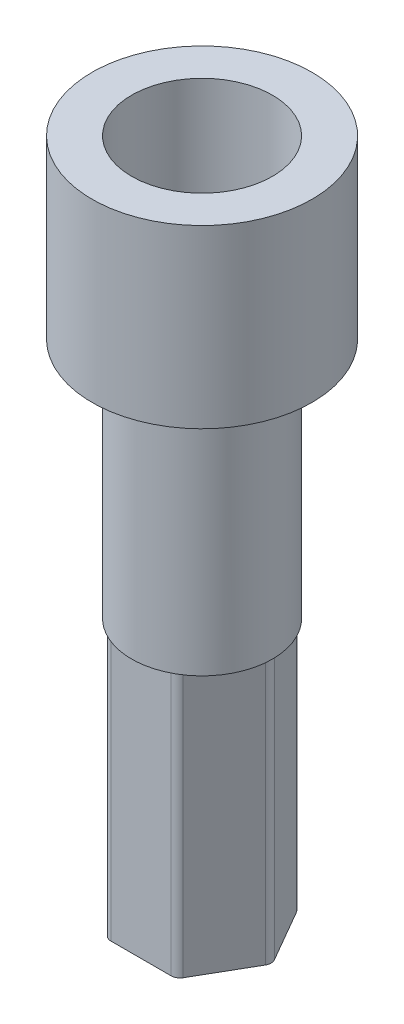
ISO-10303-21;
HEADER;
FILE_DESCRIPTION(('STEP AP214'),'2;1');
FILE_NAME('part.step','',(''),(''),'','','');
FILE_SCHEMA(('AUTOMOTIVE_DESIGN { 1 0 10303 214 1 1 1 1 }'));
ENDSEC;
DATA;
#1=APPLICATION_CONTEXT('core data for automotive mechanical design processes');
#2=APPLICATION_PROTOCOL_DEFINITION('international standard','automotive_design',2000,#1);
#3=PRODUCT_CONTEXT('',#1,'mechanical');
#4=PRODUCT('Part','Part','',(#3));
#5=PRODUCT_RELATED_PRODUCT_CATEGORY('part','',(#4));
#6=PRODUCT_DEFINITION_FORMATION('','',#4);
#7=PRODUCT_DEFINITION_CONTEXT('part definition',#1,'design');
#8=PRODUCT_DEFINITION('design','',#6,#7);
#9=PRODUCT_DEFINITION_SHAPE('','',#8);
#10=(LENGTH_UNIT() NAMED_UNIT(*) SI_UNIT(.MILLI.,.METRE.));
#11=(NAMED_UNIT(*) PLANE_ANGLE_UNIT() SI_UNIT($,.RADIAN.));
#12=(NAMED_UNIT(*) SI_UNIT($,.STERADIAN.) SOLID_ANGLE_UNIT());
#13=UNCERTAINTY_MEASURE_WITH_UNIT(LENGTH_MEASURE(1.E-05),#10,'distance_accuracy_value','');
#14=(GEOMETRIC_REPRESENTATION_CONTEXT(3) GLOBAL_UNCERTAINTY_ASSIGNED_CONTEXT((#13)) GLOBAL_UNIT_ASSIGNED_CONTEXT((#10,
#11,#12)) REPRESENTATION_CONTEXT('',''));
#15=CARTESIAN_POINT('',(0.,0.,0.));
#16=DIRECTION('',(0.,0.,1.));
#17=DIRECTION('',(1.,0.,0.));
#18=AXIS2_PLACEMENT_3D('',#15,#16,#17);
#19=CARTESIAN_POINT('',(0.,0.,0.));
#20=DIRECTION('',(0.,-1.,0.));
#21=DIRECTION('',(0.,0.,-1.));
#22=AXIS2_PLACEMENT_3D('',#19,#20,#21);
#23=PLANE('',#22);
#24=DIRECTION('',(-0.5,0.,-0.866025403784439));
#25=VECTOR('',#24,1.);
#26=CARTESIAN_POINT('',(-3.048,0.,1.75976362048998));
#27=LINE('',#26,#25);
#28=CARTESIAN_POINT('',(-2.17864696837417,0.,3.26552724097996));
#29=VERTEX_POINT('',#28);
#30=CARTESIAN_POINT('',(-3.91735303162584,0.,0.253999999999999));
#31=VERTEX_POINT('',#30);
#32=EDGE_CURVE('E309',#29,#31,#27,.T.);
#33=ORIENTED_EDGE('',*,*,#32,.T.);
#34=CARTESIAN_POINT('',(-3.47741212650334,0.,0.));
#35=DIRECTION('',(0.,-1.,0.));
#36=DIRECTION('',(0.,0.,-1.));
#37=AXIS2_PLACEMENT_3D('',#34,#35,#36);
#38=CIRCLE('',#37,0.508);
#39=CARTESIAN_POINT('',(-3.91735303162584,0.,-0.254));
#40=VERTEX_POINT('',#39);
#41=EDGE_CURVE('E224',#31,#40,#38,.T.);
#42=ORIENTED_EDGE('',*,*,#41,.T.);
#43=DIRECTION('',(0.5,0.,-0.866025403784439));
#44=VECTOR('',#43,1.);
#45=CARTESIAN_POINT('',(-3.048,0.,-1.75976362048998));
#46=LINE('',#45,#44);
#47=CARTESIAN_POINT('',(-2.17864696837417,0.,-3.26552724097996));
#48=VERTEX_POINT('',#47);
#49=EDGE_CURVE('E315',#40,#48,#46,.T.);
#50=ORIENTED_EDGE('',*,*,#49,.T.);
#51=CARTESIAN_POINT('',(-1.73870606325167,0.,-3.01152724097996));
#52=DIRECTION('',(0.,-1.,0.));
#53=DIRECTION('',(0.,0.,-1.));
#54=AXIS2_PLACEMENT_3D('',#51,#52,#53);
#55=CIRCLE('',#54,0.508);
#56=CARTESIAN_POINT('',(-1.73870606325167,0.,-3.51952724097996));
#57=VERTEX_POINT('',#56);
#58=EDGE_CURVE('E221',#48,#57,#55,.T.);
#59=ORIENTED_EDGE('',*,*,#58,.T.);
#60=DIRECTION('',(1.,0.,0.));
#61=VECTOR('',#60,1.);
#62=CARTESIAN_POINT('',(0.,0.,-3.51952724097996));
#63=LINE('',#62,#61);
#64=CARTESIAN_POINT('',(1.73870606325167,0.,-3.51952724097996));
#65=VERTEX_POINT('',#64);
#66=EDGE_CURVE('E155',#57,#65,#63,.T.);
#67=ORIENTED_EDGE('',*,*,#66,.T.);
#68=CARTESIAN_POINT('',(1.73870606325167,0.,-3.01152724097996));
#69=DIRECTION('',(0.,-1.,0.));
#70=DIRECTION('',(0.,0.,-1.));
#71=AXIS2_PLACEMENT_3D('',#68,#69,#70);
#72=CIRCLE('',#71,0.508);
#73=CARTESIAN_POINT('',(2.17864696837417,0.,-3.26552724097996));
#74=VERTEX_POINT('',#73);
#75=EDGE_CURVE('E215',#65,#74,#72,.T.);
#76=ORIENTED_EDGE('',*,*,#75,.T.);
#77=DIRECTION('',(0.5,0.,0.866025403784439));
#78=VECTOR('',#77,1.);
#79=CARTESIAN_POINT('',(3.04800000000001,0.,-1.75976362048998));
#80=LINE('',#79,#78);
#81=CARTESIAN_POINT('',(3.91735303162584,0.,-0.253999999999999));
#82=VERTEX_POINT('',#81);
#83=EDGE_CURVE('E181',#74,#82,#80,.T.);
#84=ORIENTED_EDGE('',*,*,#83,.T.);
#85=CARTESIAN_POINT('',(3.47741212650335,0.,0.));
#86=DIRECTION('',(0.,-1.,0.));
#87=DIRECTION('',(0.,0.,-1.));
#88=AXIS2_PLACEMENT_3D('',#85,#86,#87);
#89=CIRCLE('',#88,0.508);
#90=CARTESIAN_POINT('',(3.91735303162584,0.,0.254));
#91=VERTEX_POINT('',#90);
#92=EDGE_CURVE('E212',#82,#91,#89,.T.);
#93=ORIENTED_EDGE('',*,*,#92,.T.);
#94=DIRECTION('',(-0.5,0.,0.866025403784439));
#95=VECTOR('',#94,1.);
#96=CARTESIAN_POINT('',(3.048,0.,1.75976362048998));
#97=LINE('',#96,#95);
#98=CARTESIAN_POINT('',(2.17864696837417,0.,3.26552724097996));
#99=VERTEX_POINT('',#98);
#100=EDGE_CURVE('E305',#91,#99,#97,.T.);
#101=ORIENTED_EDGE('',*,*,#100,.T.);
#102=CARTESIAN_POINT('',(1.73870606325167,0.,3.01152724097996));
#103=DIRECTION('',(0.,-1.,0.));
#104=DIRECTION('',(0.,0.,-1.));
#105=AXIS2_PLACEMENT_3D('',#102,#103,#104);
#106=CIRCLE('',#105,0.508);
#107=CARTESIAN_POINT('',(1.73870606325167,0.,3.51952724097996));
#108=VERTEX_POINT('',#107);
#109=EDGE_CURVE('E209',#99,#108,#106,.T.);
#110=ORIENTED_EDGE('',*,*,#109,.T.);
#111=DIRECTION('',(-1.,0.,0.));
#112=VECTOR('',#111,1.);
#113=CARTESIAN_POINT('',(0.,0.,3.51952724097996));
#114=LINE('',#113,#112);
#115=CARTESIAN_POINT('',(-1.73870606325167,0.,3.51952724097996));
#116=VERTEX_POINT('',#115);
#117=EDGE_CURVE('E171',#108,#116,#114,.T.);
#118=ORIENTED_EDGE('',*,*,#117,.T.);
#119=CARTESIAN_POINT('',(-1.73870606325167,0.,3.01152724097996));
#120=DIRECTION('',(0.,-1.,0.));
#121=DIRECTION('',(0.,0.,-1.));
#122=AXIS2_PLACEMENT_3D('',#119,#120,#121);
#123=CIRCLE('',#122,0.508);
#124=EDGE_CURVE('E218',#116,#29,#123,.T.);
#125=ORIENTED_EDGE('',*,*,#124,.T.);
#126=EDGE_LOOP('',(#33,#42,#50,#59,#67,#76,#84,#93,#101,#110,#118,#125));
#127=FACE_BOUND('',#126,.T.);
#128=ADVANCED_FACE('F38',(#127),#23,.T.);
#129=CARTESIAN_POINT('',(0.,0.,0.));
#130=DIRECTION('',(0.,-1.,0.));
#131=DIRECTION('',(0.,0.,-1.));
#132=AXIS2_PLACEMENT_3D('',#129,#130,#131);
#133=CYLINDRICAL_SURFACE('',#132,4.064);
#134=CARTESIAN_POINT('',(0.,29.21,0.));
#135=DIRECTION('',(0.,-1.,0.));
#136=DIRECTION('',(0.,0.,-1.));
#137=AXIS2_PLACEMENT_3D('',#134,#135,#136);
#138=CIRCLE('',#137,4.064);
#139=CARTESIAN_POINT('',(0.,29.21,-4.064));
#140=VERTEX_POINT('',#139);
#141=EDGE_CURVE('E198',#140,#140,#138,.T.);
#142=ORIENTED_EDGE('',*,*,#141,.T.);
#143=EDGE_LOOP('',(#142));
#144=FACE_BOUND('',#143,.T.);
#145=CARTESIAN_POINT('',(0.,15.24,0.));
#146=DIRECTION('',(0.,-1.,0.));
#147=DIRECTION('',(0.,0.,-1.));
#148=AXIS2_PLACEMENT_3D('',#145,#146,#147);
#149=CIRCLE('',#148,4.064);
#150=CARTESIAN_POINT('',(-4.064,15.24,0.));
#151=VERTEX_POINT('',#150);
#152=CARTESIAN_POINT('',(-2.032,15.24,-3.51952724097996));
#153=VERTEX_POINT('',#152);
#154=EDGE_CURVE('E152',#151,#153,#149,.T.);
#155=ORIENTED_EDGE('',*,*,#154,.F.);
#156=CARTESIAN_POINT('',(0.,15.24,0.));
#157=DIRECTION('',(0.,-1.,0.));
#158=DIRECTION('',(0.,0.,-1.));
#159=AXIS2_PLACEMENT_3D('',#156,#157,#158);
#160=CIRCLE('',#159,4.064);
#161=CARTESIAN_POINT('',(-2.032,15.24,3.51952724097996));
#162=VERTEX_POINT('',#161);
#163=EDGE_CURVE('E147',#162,#151,#160,.T.);
#164=ORIENTED_EDGE('',*,*,#163,.F.);
#165=CARTESIAN_POINT('',(0.,15.24,0.));
#166=DIRECTION('',(0.,-1.,0.));
#167=DIRECTION('',(0.,0.,-1.));
#168=AXIS2_PLACEMENT_3D('',#165,#166,#167);
#169=CIRCLE('',#168,4.064);
#170=CARTESIAN_POINT('',(2.032,15.24,3.51952724097996));
#171=VERTEX_POINT('',#170);
#172=EDGE_CURVE('E150',#171,#162,#169,.T.);
#173=ORIENTED_EDGE('',*,*,#172,.F.);
#174=CARTESIAN_POINT('',(0.,15.24,0.));
#175=DIRECTION('',(0.,-1.,0.));
#176=DIRECTION('',(0.,0.,-1.));
#177=AXIS2_PLACEMENT_3D('',#174,#175,#176);
#178=CIRCLE('',#177,4.064);
#179=CARTESIAN_POINT('',(4.064,15.24,0.));
#180=VERTEX_POINT('',#179);
#181=EDGE_CURVE('E161',#180,#171,#178,.T.);
#182=ORIENTED_EDGE('',*,*,#181,.F.);
#183=CARTESIAN_POINT('',(0.,15.24,0.));
#184=DIRECTION('',(0.,-1.,0.));
#185=DIRECTION('',(0.,0.,-1.));
#186=AXIS2_PLACEMENT_3D('',#183,#184,#185);
#187=CIRCLE('',#186,4.064);
#188=CARTESIAN_POINT('',(2.032,15.24,-3.51952724097996));
#189=VERTEX_POINT('',#188);
#190=EDGE_CURVE('E178',#189,#180,#187,.T.);
#191=ORIENTED_EDGE('',*,*,#190,.F.);
#192=CARTESIAN_POINT('',(0.,15.24,0.));
#193=DIRECTION('',(0.,-1.,0.));
#194=DIRECTION('',(0.,0.,-1.));
#195=AXIS2_PLACEMENT_3D('',#192,#193,#194);
#196=CIRCLE('',#195,4.064);
#197=EDGE_CURVE('E301',#153,#189,#196,.T.);
#198=ORIENTED_EDGE('',*,*,#197,.F.);
#199=EDGE_LOOP('',(#155,#164,#173,#182,#191,#198));
#200=FACE_BOUND('',#199,.T.);
#201=ADVANCED_FACE('F149',(#144,#200),#133,.T.);
#202=CARTESIAN_POINT('',(0.,29.21,-4.064));
#203=DIRECTION('',(0.,-1.,0.));
#204=DIRECTION('',(0.,0.,-1.));
#205=AXIS2_PLACEMENT_3D('',#202,#203,#204);
#206=PLANE('',#205);
#207=CARTESIAN_POINT('',(0.,29.21,0.));
#208=DIRECTION('',(0.,-1.,0.));
#209=DIRECTION('',(0.,0.,-1.));
#210=AXIS2_PLACEMENT_3D('',#207,#208,#209);
#211=CIRCLE('',#210,6.35);
#212=CARTESIAN_POINT('',(0.,29.21,-6.35));
#213=VERTEX_POINT('',#212);
#214=EDGE_CURVE('E194',#213,#213,#211,.T.);
#215=ORIENTED_EDGE('',*,*,#214,.T.);
#216=EDGE_LOOP('',(#215));
#217=FACE_BOUND('',#216,.T.);
#218=ORIENTED_EDGE('',*,*,#141,.F.);
#219=EDGE_LOOP('',(#218));
#220=FACE_BOUND('',#219,.T.);
#221=ADVANCED_FACE('F356',(#217,#220),#206,.T.);
#222=CARTESIAN_POINT('',(0.,0.,0.));
#223=DIRECTION('',(0.,-1.,0.));
#224=DIRECTION('',(0.,0.,-1.));
#225=AXIS2_PLACEMENT_3D('',#222,#223,#224);
#226=CYLINDRICAL_SURFACE('',#225,6.35);
#227=CARTESIAN_POINT('',(0.,39.37,0.));
#228=DIRECTION('',(0.,-1.,0.));
#229=DIRECTION('',(0.,0.,-1.));
#230=AXIS2_PLACEMENT_3D('',#227,#228,#229);
#231=CIRCLE('',#230,6.35);
#232=CARTESIAN_POINT('',(0.,39.37,-6.35));
#233=VERTEX_POINT('',#232);
#234=EDGE_CURVE('E189',#233,#233,#231,.T.);
#235=ORIENTED_EDGE('',*,*,#234,.T.);
#236=EDGE_LOOP('',(#235));
#237=FACE_BOUND('',#236,.T.);
#238=ORIENTED_EDGE('',*,*,#214,.F.);
#239=EDGE_LOOP('',(#238));
#240=FACE_BOUND('',#239,.T.);
#241=ADVANCED_FACE('F362',(#237,#240),#226,.T.);
#242=CARTESIAN_POINT('',(0.,39.37,-6.35));
#243=DIRECTION('',(0.,1.,0.));
#244=DIRECTION('',(0.,0.,1.));
#245=AXIS2_PLACEMENT_3D('',#242,#243,#244);
#246=PLANE('',#245);
#247=CARTESIAN_POINT('',(0.,39.37,0.));
#248=DIRECTION('',(0.,1.,0.));
#249=DIRECTION('',(0.,0.,1.));
#250=AXIS2_PLACEMENT_3D('',#247,#248,#249);
#251=CIRCLE('',#250,4.064);
#252=CARTESIAN_POINT('',(0.,39.37,4.064));
#253=VERTEX_POINT('',#252);
#254=EDGE_CURVE('E163',#253,#253,#251,.T.);
#255=ORIENTED_EDGE('',*,*,#254,.F.);
#256=EDGE_LOOP('',(#255));
#257=FACE_BOUND('',#256,.T.);
#258=ORIENTED_EDGE('',*,*,#234,.F.);
#259=EDGE_LOOP('',(#258));
#260=FACE_BOUND('',#259,.T.);
#261=ADVANCED_FACE('F366',(#257,#260),#246,.T.);
#262=CARTESIAN_POINT('',(0.,30.988,0.));
#263=DIRECTION('',(0.,1.,0.));
#264=DIRECTION('',(0.,0.,1.));
#265=AXIS2_PLACEMENT_3D('',#262,#263,#264);
#266=CYLINDRICAL_SURFACE('',#265,4.064);
#267=CARTESIAN_POINT('',(0.,30.988,0.));
#268=DIRECTION('',(0.,1.,0.));
#269=DIRECTION('',(0.,0.,1.));
#270=AXIS2_PLACEMENT_3D('',#267,#268,#269);
#271=CIRCLE('',#270,4.064);
#272=CARTESIAN_POINT('',(0.,30.988,4.064));
#273=VERTEX_POINT('',#272);
#274=EDGE_CURVE('E169',#273,#273,#271,.T.);
#275=ORIENTED_EDGE('',*,*,#274,.F.);
#276=EDGE_LOOP('',(#275));
#277=FACE_BOUND('',#276,.T.);
#278=ORIENTED_EDGE('',*,*,#254,.T.);
#279=EDGE_LOOP('',(#278));
#280=FACE_BOUND('',#279,.T.);
#281=ADVANCED_FACE('F370',(#277,#280),#266,.F.);
#282=CARTESIAN_POINT('',(0.,30.988,0.));
#283=DIRECTION('',(0.,1.,0.));
#284=DIRECTION('',(0.,0.,1.));
#285=AXIS2_PLACEMENT_3D('',#282,#283,#284);
#286=PLANE('',#285);
#287=ORIENTED_EDGE('',*,*,#274,.T.);
#288=EDGE_LOOP('',(#287));
#289=FACE_BOUND('',#288,.T.);
#290=ADVANCED_FACE('F374',(#289),#286,.T.);
#291=CARTESIAN_POINT('',(0.,15.24,3.51952724097996));
#292=DIRECTION('',(0.,0.,1.));
#293=DIRECTION('',(1.,0.,0.));
#294=AXIS2_PLACEMENT_3D('',#291,#292,#293);
#295=PLANE('',#294);
#296=DIRECTION('',(-1.,0.,0.));
#297=VECTOR('',#296,1.);
#298=CARTESIAN_POINT('',(0.,15.24,3.51952724097996));
#299=LINE('',#298,#297);
#300=CARTESIAN_POINT('',(1.73870606325167,15.24,3.51952724097996));
#301=VERTEX_POINT('',#300);
#302=CARTESIAN_POINT('',(-1.73870606325167,15.24,3.51952724097996));
#303=VERTEX_POINT('',#302);
#304=EDGE_CURVE('E164',#301,#303,#299,.T.);
#305=ORIENTED_EDGE('',*,*,#304,.T.);
#306=DIRECTION('',(0.,-1.,0.));
#307=VECTOR('',#306,1.);
#308=CARTESIAN_POINT('',(-1.73870606325167,15.24,3.51952724097996));
#309=LINE('',#308,#307);
#310=EDGE_CURVE('E244',#303,#116,#309,.T.);
#311=ORIENTED_EDGE('',*,*,#310,.T.);
#312=ORIENTED_EDGE('',*,*,#117,.F.);
#313=DIRECTION('',(0.,-1.,0.));
#314=VECTOR('',#313,1.);
#315=CARTESIAN_POINT('',(1.73870606325167,15.24,3.51952724097996));
#316=LINE('',#315,#314);
#317=EDGE_CURVE('E241',#108,#301,#316,.F.);
#318=ORIENTED_EDGE('',*,*,#317,.T.);
#319=EDGE_LOOP('',(#305,#311,#312,#318));
#320=FACE_BOUND('',#319,.T.);
#321=ADVANCED_FACE('F378',(#320),#295,.T.);
#322=CARTESIAN_POINT('',(3.04800000000001,15.24,-1.75976362048998));
#323=DIRECTION('',(0.866025403784439,0.,-0.5));
#324=DIRECTION('',(-0.5,0.,-0.866025403784439));
#325=AXIS2_PLACEMENT_3D('',#322,#323,#324);
#326=PLANE('',#325);
#327=ORIENTED_EDGE('',*,*,#83,.F.);
#328=DIRECTION('',(0.,-1.,0.));
#329=VECTOR('',#328,1.);
#330=CARTESIAN_POINT('',(2.17864696837417,15.24,-3.26552724097996));
#331=LINE('',#330,#329);
#332=CARTESIAN_POINT('',(2.17864696837417,15.24,-3.26552724097996));
#333=VERTEX_POINT('',#332);
#334=EDGE_CURVE('E251',#74,#333,#331,.F.);
#335=ORIENTED_EDGE('',*,*,#334,.T.);
#336=DIRECTION('',(0.5,0.,0.866025403784439));
#337=VECTOR('',#336,1.);
#338=CARTESIAN_POINT('',(3.04800000000001,15.24,-1.75976362048998));
#339=LINE('',#338,#337);
#340=CARTESIAN_POINT('',(3.91735303162584,15.24,-0.253999999999999));
#341=VERTEX_POINT('',#340);
#342=EDGE_CURVE('E61',#333,#341,#339,.T.);
#343=ORIENTED_EDGE('',*,*,#342,.T.);
#344=DIRECTION('',(0.,-1.,0.));
#345=VECTOR('',#344,1.);
#346=CARTESIAN_POINT('',(3.91735303162584,15.24,-0.253999999999999));
#347=LINE('',#346,#345);
#348=EDGE_CURVE('E248',#341,#82,#347,.T.);
#349=ORIENTED_EDGE('',*,*,#348,.T.);
#350=EDGE_LOOP('',(#327,#335,#343,#349));
#351=FACE_BOUND('',#350,.T.);
#352=ADVANCED_FACE('F283',(#351),#326,.T.);
#353=CARTESIAN_POINT('',(-3.048,15.24,-1.75976362048998));
#354=DIRECTION('',(-0.866025403784439,0.,-0.5));
#355=DIRECTION('',(-0.5,0.,0.866025403784439));
#356=AXIS2_PLACEMENT_3D('',#353,#354,#355);
#357=PLANE('',#356);
#358=ORIENTED_EDGE('',*,*,#49,.F.);
#359=DIRECTION('',(0.,-1.,0.));
#360=VECTOR('',#359,1.);
#361=CARTESIAN_POINT('',(-3.91735303162584,15.24,-0.254));
#362=LINE('',#361,#360);
#363=CARTESIAN_POINT('',(-3.91735303162584,15.24,-0.254));
#364=VERTEX_POINT('',#363);
#365=EDGE_CURVE('E231',#40,#364,#362,.F.);
#366=ORIENTED_EDGE('',*,*,#365,.T.);
#367=DIRECTION('',(0.5,0.,-0.866025403784439));
#368=VECTOR('',#367,1.);
#369=CARTESIAN_POINT('',(-3.048,15.24,-1.75976362048998));
#370=LINE('',#369,#368);
#371=CARTESIAN_POINT('',(-2.17864696837417,15.24,-3.26552724097996));
#372=VERTEX_POINT('',#371);
#373=EDGE_CURVE('E318',#364,#372,#370,.T.);
#374=ORIENTED_EDGE('',*,*,#373,.T.);
#375=DIRECTION('',(0.,-1.,0.));
#376=VECTOR('',#375,1.);
#377=CARTESIAN_POINT('',(-2.17864696837417,15.24,-3.26552724097996));
#378=LINE('',#377,#376);
#379=EDGE_CURVE('E227',#372,#48,#378,.T.);
#380=ORIENTED_EDGE('',*,*,#379,.T.);
#381=EDGE_LOOP('',(#358,#366,#374,#380));
#382=FACE_BOUND('',#381,.T.);
#383=ADVANCED_FACE('F327',(#382),#357,.T.);
#384=CARTESIAN_POINT('',(3.048,15.24,1.75976362048998));
#385=DIRECTION('',(0.866025403784439,0.,0.5));
#386=DIRECTION('',(0.5,0.,-0.866025403784439));
#387=AXIS2_PLACEMENT_3D('',#384,#385,#386);
#388=PLANE('',#387);
#389=ORIENTED_EDGE('',*,*,#100,.F.);
#390=DIRECTION('',(0.,-1.,0.));
#391=VECTOR('',#390,1.);
#392=CARTESIAN_POINT('',(3.91735303162584,15.24,0.254));
#393=LINE('',#392,#391);
#394=CARTESIAN_POINT('',(3.91735303162584,15.24,0.254));
#395=VERTEX_POINT('',#394);
#396=EDGE_CURVE('E257',#91,#395,#393,.F.);
#397=ORIENTED_EDGE('',*,*,#396,.T.);
#398=DIRECTION('',(-0.5,0.,0.866025403784439));
#399=VECTOR('',#398,1.);
#400=CARTESIAN_POINT('',(3.048,15.24,1.75976362048998));
#401=LINE('',#400,#399);
#402=CARTESIAN_POINT('',(2.17864696837417,15.24,3.26552724097996));
#403=VERTEX_POINT('',#402);
#404=EDGE_CURVE('E54',#395,#403,#401,.T.);
#405=ORIENTED_EDGE('',*,*,#404,.T.);
#406=DIRECTION('',(0.,-1.,0.));
#407=VECTOR('',#406,1.);
#408=CARTESIAN_POINT('',(2.17864696837417,15.24,3.26552724097996));
#409=LINE('',#408,#407);
#410=EDGE_CURVE('E254',#403,#99,#409,.T.);
#411=ORIENTED_EDGE('',*,*,#410,.T.);
#412=EDGE_LOOP('',(#389,#397,#405,#411));
#413=FACE_BOUND('',#412,.T.);
#414=ADVANCED_FACE('F386',(#413),#388,.T.);
#415=CARTESIAN_POINT('',(0.,15.24,0.));
#416=DIRECTION('',(0.,-1.,0.));
#417=DIRECTION('',(0.,0.,-1.));
#418=AXIS2_PLACEMENT_3D('',#415,#416,#417);
#419=PLANE('',#418);
#420=ORIENTED_EDGE('',*,*,#181,.T.);
#421=ORIENTED_EDGE('',*,*,#172,.T.);
#422=ORIENTED_EDGE('',*,*,#163,.T.);
#423=ORIENTED_EDGE('',*,*,#154,.T.);
#424=ORIENTED_EDGE('',*,*,#197,.T.);
#425=ORIENTED_EDGE('',*,*,#190,.T.);
#426=EDGE_LOOP('',(#420,#421,#422,#423,#424,#425));
#427=FACE_BOUND('',#426,.T.);
#428=ORIENTED_EDGE('',*,*,#404,.F.);
#429=CARTESIAN_POINT('',(3.47741212650335,15.24,0.));
#430=DIRECTION('',(0.,-1.,0.));
#431=DIRECTION('',(0.,0.,-1.));
#432=AXIS2_PLACEMENT_3D('',#429,#430,#431);
#433=CIRCLE('',#432,0.508);
#434=EDGE_CURVE('E47',#395,#341,#433,.F.);
#435=ORIENTED_EDGE('',*,*,#434,.T.);
#436=ORIENTED_EDGE('',*,*,#342,.F.);
#437=CARTESIAN_POINT('',(1.73870606325167,15.24,-3.01152724097996));
#438=DIRECTION('',(0.,-1.,0.));
#439=DIRECTION('',(0.,0.,-1.));
#440=AXIS2_PLACEMENT_3D('',#437,#438,#439);
#441=CIRCLE('',#440,0.508);
#442=CARTESIAN_POINT('',(1.73870606325167,15.24,-3.51952724097996));
#443=VERTEX_POINT('',#442);
#444=EDGE_CURVE('E272',#333,#443,#441,.F.);
#445=ORIENTED_EDGE('',*,*,#444,.T.);
#446=DIRECTION('',(1.,0.,0.));
#447=VECTOR('',#446,1.);
#448=CARTESIAN_POINT('',(0.,15.24,-3.51952724097996));
#449=LINE('',#448,#447);
#450=CARTESIAN_POINT('',(-1.73870606325167,15.24,-3.51952724097996));
#451=VERTEX_POINT('',#450);
#452=EDGE_CURVE('E298',#451,#443,#449,.T.);
#453=ORIENTED_EDGE('',*,*,#452,.F.);
#454=CARTESIAN_POINT('',(-1.73870606325167,15.24,-3.01152724097996));
#455=DIRECTION('',(0.,-1.,0.));
#456=DIRECTION('',(0.,0.,-1.));
#457=AXIS2_PLACEMENT_3D('',#454,#455,#456);
#458=CIRCLE('',#457,0.508);
#459=EDGE_CURVE('E264',#451,#372,#458,.F.);
#460=ORIENTED_EDGE('',*,*,#459,.T.);
#461=ORIENTED_EDGE('',*,*,#373,.F.);
#462=CARTESIAN_POINT('',(-3.47741212650334,15.24,0.));
#463=DIRECTION('',(0.,-1.,0.));
#464=DIRECTION('',(0.,0.,-1.));
#465=AXIS2_PLACEMENT_3D('',#462,#463,#464);
#466=CIRCLE('',#465,0.508);
#467=CARTESIAN_POINT('',(-3.91735303162584,15.24,0.253999999999999));
#468=VERTEX_POINT('',#467);
#469=EDGE_CURVE('E260',#364,#468,#466,.F.);
#470=ORIENTED_EDGE('',*,*,#469,.T.);
#471=DIRECTION('',(-0.5,0.,-0.866025403784439));
#472=VECTOR('',#471,1.);
#473=CARTESIAN_POINT('',(-3.048,15.24,1.75976362048998));
#474=LINE('',#473,#472);
#475=CARTESIAN_POINT('',(-2.17864696837417,15.24,3.26552724097996));
#476=VERTEX_POINT('',#475);
#477=EDGE_CURVE('E156',#476,#468,#474,.T.);
#478=ORIENTED_EDGE('',*,*,#477,.F.);
#479=CARTESIAN_POINT('',(-1.73870606325167,15.24,3.01152724097996));
#480=DIRECTION('',(0.,-1.,0.));
#481=DIRECTION('',(0.,0.,-1.));
#482=AXIS2_PLACEMENT_3D('',#479,#480,#481);
#483=CIRCLE('',#482,0.508);
#484=EDGE_CURVE('E268',#476,#303,#483,.F.);
#485=ORIENTED_EDGE('',*,*,#484,.T.);
#486=ORIENTED_EDGE('',*,*,#304,.F.);
#487=CARTESIAN_POINT('',(1.73870606325167,15.24,3.01152724097996));
#488=DIRECTION('',(0.,-1.,0.));
#489=DIRECTION('',(0.,0.,-1.));
#490=AXIS2_PLACEMENT_3D('',#487,#488,#489);
#491=CIRCLE('',#490,0.508);
#492=EDGE_CURVE('E11',#301,#403,#491,.F.);
#493=ORIENTED_EDGE('',*,*,#492,.T.);
#494=EDGE_LOOP('',(#428,#435,#436,#445,#453,#460,#461,#470,#478,#485,#486,#493));
#495=FACE_BOUND('',#494,.T.);
#496=ADVANCED_FACE('F158',(#427,#495),#419,.T.);
#497=CARTESIAN_POINT('',(0.,15.24,-3.51952724097996));
#498=DIRECTION('',(0.,0.,-1.));
#499=DIRECTION('',(-1.,0.,0.));
#500=AXIS2_PLACEMENT_3D('',#497,#498,#499);
#501=PLANE('',#500);
#502=ORIENTED_EDGE('',*,*,#66,.F.);
#503=DIRECTION('',(0.,-1.,0.));
#504=VECTOR('',#503,1.);
#505=CARTESIAN_POINT('',(-1.73870606325167,15.24,-3.51952724097996));
#506=LINE('',#505,#504);
#507=EDGE_CURVE('E238',#57,#451,#506,.F.);
#508=ORIENTED_EDGE('',*,*,#507,.T.);
#509=ORIENTED_EDGE('',*,*,#452,.T.);
#510=DIRECTION('',(0.,-1.,0.));
#511=VECTOR('',#510,1.);
#512=CARTESIAN_POINT('',(1.73870606325167,15.24,-3.51952724097996));
#513=LINE('',#512,#511);
#514=EDGE_CURVE('E234',#443,#65,#513,.T.);
#515=ORIENTED_EDGE('',*,*,#514,.T.);
#516=EDGE_LOOP('',(#502,#508,#509,#515));
#517=FACE_BOUND('',#516,.T.);
#518=ADVANCED_FACE('F295',(#517),#501,.T.);
#519=CARTESIAN_POINT('',(-3.048,15.24,1.75976362048998));
#520=DIRECTION('',(-0.866025403784439,0.,0.5));
#521=DIRECTION('',(0.5,0.,0.866025403784439));
#522=AXIS2_PLACEMENT_3D('',#519,#520,#521);
#523=PLANE('',#522);
#524=ORIENTED_EDGE('',*,*,#477,.T.);
#525=DIRECTION('',(0.,-1.,0.));
#526=VECTOR('',#525,1.);
#527=CARTESIAN_POINT('',(-3.91735303162584,15.24,0.253999999999999));
#528=LINE('',#527,#526);
#529=EDGE_CURVE('E205',#468,#31,#528,.T.);
#530=ORIENTED_EDGE('',*,*,#529,.T.);
#531=ORIENTED_EDGE('',*,*,#32,.F.);
#532=DIRECTION('',(0.,-1.,0.));
#533=VECTOR('',#532,1.);
#534=CARTESIAN_POINT('',(-2.17864696837417,15.24,3.26552724097996));
#535=LINE('',#534,#533);
#536=EDGE_CURVE('E202',#29,#476,#535,.F.);
#537=ORIENTED_EDGE('',*,*,#536,.T.);
#538=EDGE_LOOP('',(#524,#530,#531,#537));
#539=FACE_BOUND('',#538,.T.);
#540=ADVANCED_FACE('F347',(#539),#523,.T.);
#541=CARTESIAN_POINT('',(-3.47741212650334,15.24,0.));
#542=DIRECTION('',(0.,-1.,0.));
#543=DIRECTION('',(0.,0.,-1.));
#544=AXIS2_PLACEMENT_3D('',#541,#542,#543);
#545=CYLINDRICAL_SURFACE('',#544,0.508);
#546=ORIENTED_EDGE('',*,*,#469,.F.);
#547=ORIENTED_EDGE('',*,*,#365,.F.);
#548=ORIENTED_EDGE('',*,*,#41,.F.);
#549=ORIENTED_EDGE('',*,*,#529,.F.);
#550=EDGE_LOOP('',(#546,#547,#548,#549));
#551=FACE_BOUND('',#550,.T.);
#552=ADVANCED_FACE('F332',(#551),#545,.T.);
#553=CARTESIAN_POINT('',(-1.73870606325167,15.24,-3.01152724097996));
#554=DIRECTION('',(0.,-1.,0.));
#555=DIRECTION('',(0.,0.,-1.));
#556=AXIS2_PLACEMENT_3D('',#553,#554,#555);
#557=CYLINDRICAL_SURFACE('',#556,0.508);
#558=ORIENTED_EDGE('',*,*,#459,.F.);
#559=ORIENTED_EDGE('',*,*,#507,.F.);
#560=ORIENTED_EDGE('',*,*,#58,.F.);
#561=ORIENTED_EDGE('',*,*,#379,.F.);
#562=EDGE_LOOP('',(#558,#559,#560,#561));
#563=FACE_BOUND('',#562,.T.);
#564=ADVANCED_FACE('F337',(#563),#557,.T.);
#565=CARTESIAN_POINT('',(-1.73870606325167,15.24,3.01152724097996));
#566=DIRECTION('',(0.,-1.,0.));
#567=DIRECTION('',(0.,0.,-1.));
#568=AXIS2_PLACEMENT_3D('',#565,#566,#567);
#569=CYLINDRICAL_SURFACE('',#568,0.508);
#570=ORIENTED_EDGE('',*,*,#484,.F.);
#571=ORIENTED_EDGE('',*,*,#536,.F.);
#572=ORIENTED_EDGE('',*,*,#124,.F.);
#573=ORIENTED_EDGE('',*,*,#310,.F.);
#574=EDGE_LOOP('',(#570,#571,#572,#573));
#575=FACE_BOUND('',#574,.T.);
#576=ADVANCED_FACE('F339',(#575),#569,.T.);
#577=CARTESIAN_POINT('',(1.73870606325167,15.24,-3.01152724097996));
#578=DIRECTION('',(0.,-1.,0.));
#579=DIRECTION('',(0.,0.,-1.));
#580=AXIS2_PLACEMENT_3D('',#577,#578,#579);
#581=CYLINDRICAL_SURFACE('',#580,0.508);
#582=ORIENTED_EDGE('',*,*,#444,.F.);
#583=ORIENTED_EDGE('',*,*,#334,.F.);
#584=ORIENTED_EDGE('',*,*,#75,.F.);
#585=ORIENTED_EDGE('',*,*,#514,.F.);
#586=EDGE_LOOP('',(#582,#583,#584,#585));
#587=FACE_BOUND('',#586,.T.);
#588=ADVANCED_FACE('F293',(#587),#581,.T.);
#589=CARTESIAN_POINT('',(3.47741212650335,15.24,0.));
#590=DIRECTION('',(0.,-1.,0.));
#591=DIRECTION('',(0.,0.,-1.));
#592=AXIS2_PLACEMENT_3D('',#589,#590,#591);
#593=CYLINDRICAL_SURFACE('',#592,0.508);
#594=ORIENTED_EDGE('',*,*,#434,.F.);
#595=ORIENTED_EDGE('',*,*,#396,.F.);
#596=ORIENTED_EDGE('',*,*,#92,.F.);
#597=ORIENTED_EDGE('',*,*,#348,.F.);
#598=EDGE_LOOP('',(#594,#595,#596,#597));
#599=FACE_BOUND('',#598,.T.);
#600=ADVANCED_FACE('F281',(#599),#593,.T.);
#601=CARTESIAN_POINT('',(1.73870606325167,15.24,3.01152724097996));
#602=DIRECTION('',(0.,-1.,0.));
#603=DIRECTION('',(0.,0.,-1.));
#604=AXIS2_PLACEMENT_3D('',#601,#602,#603);
#605=CYLINDRICAL_SURFACE('',#604,0.508);
#606=ORIENTED_EDGE('',*,*,#492,.F.);
#607=ORIENTED_EDGE('',*,*,#317,.F.);
#608=ORIENTED_EDGE('',*,*,#109,.F.);
#609=ORIENTED_EDGE('',*,*,#410,.F.);
#610=EDGE_LOOP('',(#606,#607,#608,#609));
#611=FACE_BOUND('',#610,.T.);
#612=ADVANCED_FACE('F40',(#611),#605,.T.);
#613=CLOSED_SHELL('',(#128,#201,#221,#241,#261,#281,#290,#321,#352,#383,#414,#496,#518,#540,
#552,#564,#576,#588,#600,#612));
#614=MANIFOLD_SOLID_BREP('B2',#613);
#615=ADVANCED_BREP_SHAPE_REPRESENTATION('',(#18,#614),#14);
#616=SHAPE_DEFINITION_REPRESENTATION(#9,#615);
ENDSEC;
END-ISO-10303-21;
